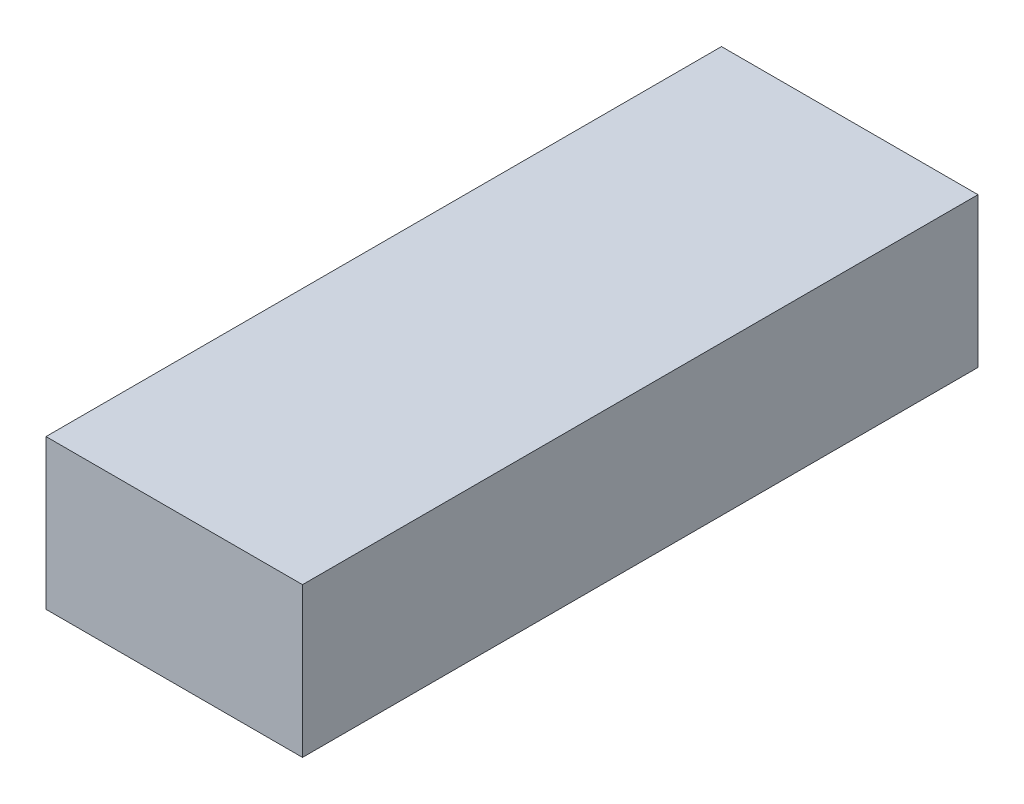
ISO-10303-21;
HEADER;
FILE_DESCRIPTION(('STEP AP214'),'2;1');
FILE_NAME('part.step','',(''),(''),'','','');
FILE_SCHEMA(('AUTOMOTIVE_DESIGN { 1 0 10303 214 1 1 1 1 }'));
ENDSEC;
DATA;
#1=APPLICATION_CONTEXT('core data for automotive mechanical design processes');
#2=APPLICATION_PROTOCOL_DEFINITION('international standard','automotive_design',2000,#1);
#3=PRODUCT_CONTEXT('',#1,'mechanical');
#4=PRODUCT('Part','Part','',(#3));
#5=PRODUCT_RELATED_PRODUCT_CATEGORY('part','',(#4));
#6=PRODUCT_DEFINITION_FORMATION('','',#4);
#7=PRODUCT_DEFINITION_CONTEXT('part definition',#1,'design');
#8=PRODUCT_DEFINITION('design','',#6,#7);
#9=PRODUCT_DEFINITION_SHAPE('','',#8);
#10=(LENGTH_UNIT() NAMED_UNIT(*) SI_UNIT(.MILLI.,.METRE.));
#11=(NAMED_UNIT(*) PLANE_ANGLE_UNIT() SI_UNIT($,.RADIAN.));
#12=(NAMED_UNIT(*) SI_UNIT($,.STERADIAN.) SOLID_ANGLE_UNIT());
#13=UNCERTAINTY_MEASURE_WITH_UNIT(LENGTH_MEASURE(1.E-05),#10,'distance_accuracy_value','');
#14=(GEOMETRIC_REPRESENTATION_CONTEXT(3) GLOBAL_UNCERTAINTY_ASSIGNED_CONTEXT((#13)) GLOBAL_UNIT_ASSIGNED_CONTEXT((#10,
#11,#12)) REPRESENTATION_CONTEXT('',''));
#15=CARTESIAN_POINT('',(0.,0.,0.));
#16=DIRECTION('',(0.,0.,1.));
#17=DIRECTION('',(1.,0.,0.));
#18=AXIS2_PLACEMENT_3D('',#15,#16,#17);
#19=CARTESIAN_POINT('',(6.223,4.445,0.));
#20=DIRECTION('',(-1.,0.,0.));
#21=DIRECTION('',(0.,0.,1.));
#22=AXIS2_PLACEMENT_3D('',#19,#20,#21);
#23=PLANE('',#22);
#24=DIRECTION('',(0.,0.,-1.));
#25=VECTOR('',#24,1.);
#26=CARTESIAN_POINT('',(6.223,0.,0.));
#27=LINE('',#26,#25);
#28=CARTESIAN_POINT('',(6.223,0.,6.223));
#29=VERTEX_POINT('',#28);
#30=CARTESIAN_POINT('',(6.223,0.,-13.843));
#31=VERTEX_POINT('',#30);
#32=EDGE_CURVE('E98',#29,#31,#27,.T.);
#33=ORIENTED_EDGE('',*,*,#32,.F.);
#34=DIRECTION('',(0.,-1.,0.));
#35=VECTOR('',#34,1.);
#36=CARTESIAN_POINT('',(6.223,4.445,6.223));
#37=LINE('',#36,#35);
#38=CARTESIAN_POINT('',(6.223,4.445,6.223));
#39=VERTEX_POINT('',#38);
#40=EDGE_CURVE('E11',#39,#29,#37,.T.);
#41=ORIENTED_EDGE('',*,*,#40,.F.);
#42=DIRECTION('',(0.,0.,-1.));
#43=VECTOR('',#42,1.);
#44=CARTESIAN_POINT('',(6.223,4.445,0.));
#45=LINE('',#44,#43);
#46=CARTESIAN_POINT('',(6.223,4.445,-13.843));
#47=VERTEX_POINT('',#46);
#48=EDGE_CURVE('E90',#39,#47,#45,.T.);
#49=ORIENTED_EDGE('',*,*,#48,.T.);
#50=DIRECTION('',(0.,-1.,0.));
#51=VECTOR('',#50,1.);
#52=CARTESIAN_POINT('',(6.223,4.445,-13.843));
#53=LINE('',#52,#51);
#54=EDGE_CURVE('E51',#47,#31,#53,.T.);
#55=ORIENTED_EDGE('',*,*,#54,.T.);
#56=EDGE_LOOP('',(#33,#41,#49,#55));
#57=FACE_BOUND('',#56,.T.);
#58=ADVANCED_FACE('F35',(#57),#23,.T.);
#59=CARTESIAN_POINT('',(0.,4.445,6.223));
#60=DIRECTION('',(0.,0.,1.));
#61=DIRECTION('',(1.,0.,0.));
#62=AXIS2_PLACEMENT_3D('',#59,#60,#61);
#63=PLANE('',#62);
#64=DIRECTION('',(-1.,0.,0.));
#65=VECTOR('',#64,1.);
#66=CARTESIAN_POINT('',(0.,0.,6.223));
#67=LINE('',#66,#65);
#68=CARTESIAN_POINT('',(13.843,0.,6.223));
#69=VERTEX_POINT('',#68);
#70=EDGE_CURVE('E81',#69,#29,#67,.T.);
#71=ORIENTED_EDGE('',*,*,#70,.F.);
#72=DIRECTION('',(0.,-1.,0.));
#73=VECTOR('',#72,1.);
#74=CARTESIAN_POINT('',(13.843,4.445,6.223));
#75=LINE('',#74,#73);
#76=CARTESIAN_POINT('',(13.843,4.445,6.223));
#77=VERTEX_POINT('',#76);
#78=EDGE_CURVE('E43',#77,#69,#75,.T.);
#79=ORIENTED_EDGE('',*,*,#78,.F.);
#80=DIRECTION('',(-1.,0.,0.));
#81=VECTOR('',#80,1.);
#82=CARTESIAN_POINT('',(0.,4.445,6.223));
#83=LINE('',#82,#81);
#84=EDGE_CURVE('E79',#77,#39,#83,.T.);
#85=ORIENTED_EDGE('',*,*,#84,.T.);
#86=ORIENTED_EDGE('',*,*,#40,.T.);
#87=EDGE_LOOP('',(#71,#79,#85,#86));
#88=FACE_BOUND('',#87,.T.);
#89=ADVANCED_FACE('F78',(#88),#63,.T.);
#90=CARTESIAN_POINT('',(13.843,4.445,0.));
#91=DIRECTION('',(1.,0.,0.));
#92=DIRECTION('',(0.,0.,-1.));
#93=AXIS2_PLACEMENT_3D('',#90,#91,#92);
#94=PLANE('',#93);
#95=DIRECTION('',(0.,0.,1.));
#96=VECTOR('',#95,1.);
#97=CARTESIAN_POINT('',(13.843,0.,0.));
#98=LINE('',#97,#96);
#99=CARTESIAN_POINT('',(13.843,0.,-13.843));
#100=VERTEX_POINT('',#99);
#101=EDGE_CURVE('E101',#100,#69,#98,.T.);
#102=ORIENTED_EDGE('',*,*,#101,.F.);
#103=DIRECTION('',(0.,-1.,0.));
#104=VECTOR('',#103,1.);
#105=CARTESIAN_POINT('',(13.843,4.445,-13.843));
#106=LINE('',#105,#104);
#107=CARTESIAN_POINT('',(13.843,4.445,-13.843));
#108=VERTEX_POINT('',#107);
#109=EDGE_CURVE('E64',#108,#100,#106,.T.);
#110=ORIENTED_EDGE('',*,*,#109,.F.);
#111=DIRECTION('',(0.,0.,1.));
#112=VECTOR('',#111,1.);
#113=CARTESIAN_POINT('',(13.843,4.445,0.));
#114=LINE('',#113,#112);
#115=EDGE_CURVE('E89',#108,#77,#114,.T.);
#116=ORIENTED_EDGE('',*,*,#115,.T.);
#117=ORIENTED_EDGE('',*,*,#78,.T.);
#118=EDGE_LOOP('',(#102,#110,#116,#117));
#119=FACE_BOUND('',#118,.T.);
#120=ADVANCED_FACE('F92',(#119),#94,.T.);
#121=CARTESIAN_POINT('',(0.,4.445,-13.843));
#122=DIRECTION('',(0.,0.,-1.));
#123=DIRECTION('',(-1.,0.,0.));
#124=AXIS2_PLACEMENT_3D('',#121,#122,#123);
#125=PLANE('',#124);
#126=DIRECTION('',(1.,0.,0.));
#127=VECTOR('',#126,1.);
#128=CARTESIAN_POINT('',(0.,0.,-13.843));
#129=LINE('',#128,#127);
#130=EDGE_CURVE('E103',#31,#100,#129,.T.);
#131=ORIENTED_EDGE('',*,*,#130,.F.);
#132=ORIENTED_EDGE('',*,*,#54,.F.);
#133=DIRECTION('',(1.,0.,0.));
#134=VECTOR('',#133,1.);
#135=CARTESIAN_POINT('',(0.,4.445,-13.843));
#136=LINE('',#135,#134);
#137=EDGE_CURVE('E93',#47,#108,#136,.T.);
#138=ORIENTED_EDGE('',*,*,#137,.T.);
#139=ORIENTED_EDGE('',*,*,#109,.T.);
#140=EDGE_LOOP('',(#131,#132,#138,#139));
#141=FACE_BOUND('',#140,.T.);
#142=ADVANCED_FACE('F108',(#141),#125,.T.);
#143=CARTESIAN_POINT('',(0.,4.445,0.));
#144=DIRECTION('',(0.,1.,0.));
#145=DIRECTION('',(0.,0.,1.));
#146=AXIS2_PLACEMENT_3D('',#143,#144,#145);
#147=PLANE('',#146);
#148=ORIENTED_EDGE('',*,*,#48,.F.);
#149=ORIENTED_EDGE('',*,*,#84,.F.);
#150=ORIENTED_EDGE('',*,*,#115,.F.);
#151=ORIENTED_EDGE('',*,*,#137,.F.);
#152=EDGE_LOOP('',(#148,#149,#150,#151));
#153=FACE_BOUND('',#152,.T.);
#154=ADVANCED_FACE('F87',(#153),#147,.T.);
#155=CARTESIAN_POINT('',(0.,0.,0.));
#156=DIRECTION('',(0.,1.,0.));
#157=DIRECTION('',(0.,0.,1.));
#158=AXIS2_PLACEMENT_3D('',#155,#156,#157);
#159=PLANE('',#158);
#160=ORIENTED_EDGE('',*,*,#32,.T.);
#161=ORIENTED_EDGE('',*,*,#130,.T.);
#162=ORIENTED_EDGE('',*,*,#101,.T.);
#163=ORIENTED_EDGE('',*,*,#70,.T.);
#164=EDGE_LOOP('',(#160,#161,#162,#163));
#165=FACE_BOUND('',#164,.T.);
#166=ADVANCED_FACE('F115',(#165),#159,.F.);
#167=CLOSED_SHELL('',(#58,#89,#120,#142,#154,#166));
#168=MANIFOLD_SOLID_BREP('B2',#167);
#169=ADVANCED_BREP_SHAPE_REPRESENTATION('',(#18,#168),#14);
#170=SHAPE_DEFINITION_REPRESENTATION(#9,#169);
ENDSEC;
END-ISO-10303-21;
